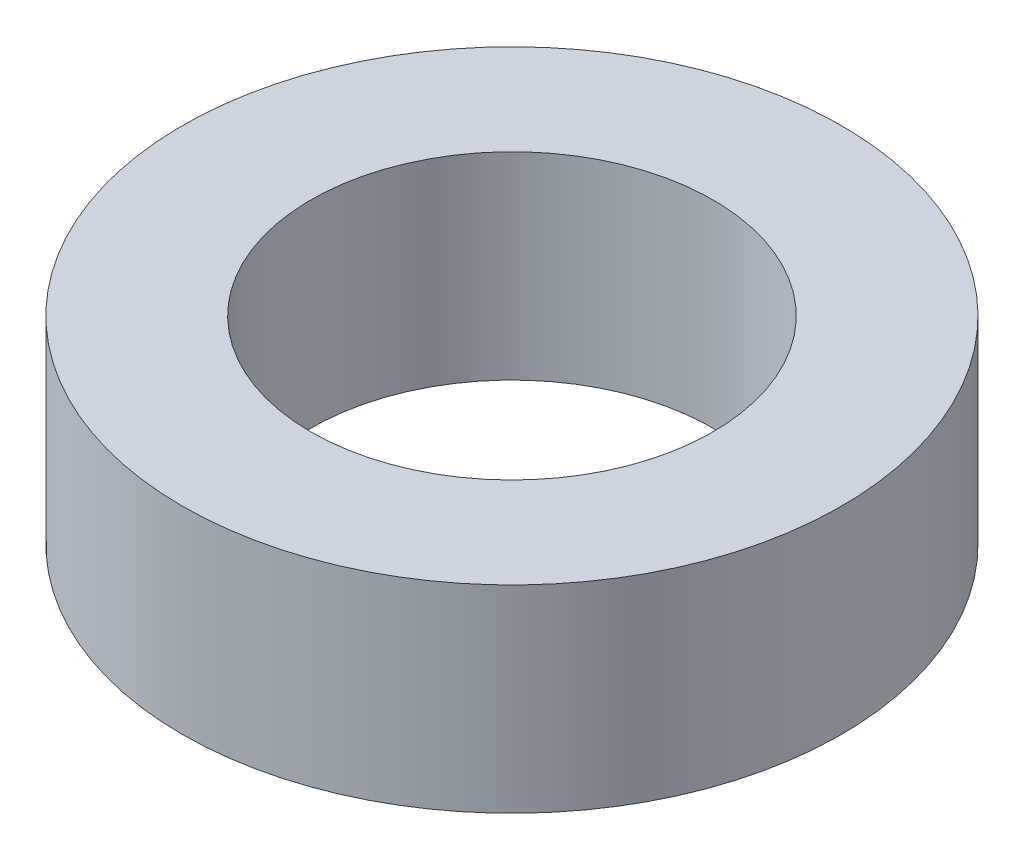
ISO-10303-21;
HEADER;
FILE_DESCRIPTION(('STEP AP214'),'2;1');
FILE_NAME('part.step','',(''),(''),'','','');
FILE_SCHEMA(('AUTOMOTIVE_DESIGN { 1 0 10303 214 1 1 1 1 }'));
ENDSEC;
DATA;
#1=APPLICATION_CONTEXT('core data for automotive mechanical design processes');
#2=APPLICATION_PROTOCOL_DEFINITION('international standard','automotive_design',2000,#1);
#3=PRODUCT_CONTEXT('',#1,'mechanical');
#4=PRODUCT('Part','Part','',(#3));
#5=PRODUCT_RELATED_PRODUCT_CATEGORY('part','',(#4));
#6=PRODUCT_DEFINITION_FORMATION('','',#4);
#7=PRODUCT_DEFINITION_CONTEXT('part definition',#1,'design');
#8=PRODUCT_DEFINITION('design','',#6,#7);
#9=PRODUCT_DEFINITION_SHAPE('','',#8);
#10=(LENGTH_UNIT() NAMED_UNIT(*) SI_UNIT(.MILLI.,.METRE.));
#11=(NAMED_UNIT(*) PLANE_ANGLE_UNIT() SI_UNIT($,.RADIAN.));
#12=(NAMED_UNIT(*) SI_UNIT($,.STERADIAN.) SOLID_ANGLE_UNIT());
#13=UNCERTAINTY_MEASURE_WITH_UNIT(LENGTH_MEASURE(1.E-05),#10,'distance_accuracy_value','');
#14=(GEOMETRIC_REPRESENTATION_CONTEXT(3) GLOBAL_UNCERTAINTY_ASSIGNED_CONTEXT((#13)) GLOBAL_UNIT_ASSIGNED_CONTEXT((#10,
#11,#12)) REPRESENTATION_CONTEXT('',''));
#15=CARTESIAN_POINT('',(0.,0.,0.));
#16=DIRECTION('',(0.,0.,1.));
#17=DIRECTION('',(1.,0.,0.));
#18=AXIS2_PLACEMENT_3D('',#15,#16,#17);
#19=CARTESIAN_POINT('',(0.,1.5,0.));
#20=DIRECTION('',(0.,1.,0.));
#21=DIRECTION('',(0.,0.,1.));
#22=AXIS2_PLACEMENT_3D('',#19,#20,#21);
#23=PLANE('',#22);
#24=CARTESIAN_POINT('',(0.,1.5,0.));
#25=DIRECTION('',(0.,1.,0.));
#26=DIRECTION('',(0.,0.,1.));
#27=AXIS2_PLACEMENT_3D('',#24,#25,#26);
#28=CIRCLE('',#27,5.);
#29=CARTESIAN_POINT('',(0.,1.5,5.));
#30=VERTEX_POINT('',#29);
#31=EDGE_CURVE('E10',#30,#30,#28,.T.);
#32=ORIENTED_EDGE('',*,*,#31,.T.);
#33=EDGE_LOOP('',(#32));
#34=FACE_BOUND('',#33,.T.);
#35=CARTESIAN_POINT('',(0.,1.5,0.));
#36=DIRECTION('',(0.,1.,0.));
#37=DIRECTION('',(0.,0.,1.));
#38=AXIS2_PLACEMENT_3D('',#35,#36,#37);
#39=CIRCLE('',#38,3.05);
#40=CARTESIAN_POINT('',(0.,1.5,3.05));
#41=VERTEX_POINT('',#40);
#42=EDGE_CURVE('E50',#41,#41,#39,.T.);
#43=ORIENTED_EDGE('',*,*,#42,.F.);
#44=EDGE_LOOP('',(#43));
#45=FACE_BOUND('',#44,.T.);
#46=ADVANCED_FACE('F37',(#34,#45),#23,.T.);
#47=CARTESIAN_POINT('',(0.,-1.5,0.));
#48=DIRECTION('',(0.,1.,0.));
#49=DIRECTION('',(0.,0.,1.));
#50=AXIS2_PLACEMENT_3D('',#47,#48,#49);
#51=PLANE('',#50);
#52=CARTESIAN_POINT('',(0.,-1.5,0.));
#53=DIRECTION('',(0.,1.,0.));
#54=DIRECTION('',(0.,0.,1.));
#55=AXIS2_PLACEMENT_3D('',#52,#53,#54);
#56=CIRCLE('',#55,5.);
#57=CARTESIAN_POINT('',(0.,-1.5,5.));
#58=VERTEX_POINT('',#57);
#59=EDGE_CURVE('E41',#58,#58,#56,.T.);
#60=ORIENTED_EDGE('',*,*,#59,.F.);
#61=EDGE_LOOP('',(#60));
#62=FACE_BOUND('',#61,.T.);
#63=CARTESIAN_POINT('',(0.,-1.5,0.));
#64=DIRECTION('',(0.,1.,0.));
#65=DIRECTION('',(0.,0.,1.));
#66=AXIS2_PLACEMENT_3D('',#63,#64,#65);
#67=CIRCLE('',#66,3.05);
#68=CARTESIAN_POINT('',(0.,-1.5,3.05));
#69=VERTEX_POINT('',#68);
#70=EDGE_CURVE('E52',#69,#69,#67,.T.);
#71=ORIENTED_EDGE('',*,*,#70,.T.);
#72=EDGE_LOOP('',(#71));
#73=FACE_BOUND('',#72,.T.);
#74=ADVANCED_FACE('F64',(#62,#73),#51,.F.);
#75=CARTESIAN_POINT('',(0.,1.5,0.));
#76=DIRECTION('',(0.,-1.,0.));
#77=DIRECTION('',(0.,0.,-1.));
#78=AXIS2_PLACEMENT_3D('',#75,#76,#77);
#79=CYLINDRICAL_SURFACE('',#78,5.);
#80=ORIENTED_EDGE('',*,*,#31,.F.);
#81=EDGE_LOOP('',(#80));
#82=FACE_BOUND('',#81,.T.);
#83=ORIENTED_EDGE('',*,*,#59,.T.);
#84=EDGE_LOOP('',(#83));
#85=FACE_BOUND('',#84,.T.);
#86=ADVANCED_FACE('F39',(#82,#85),#79,.T.);
#87=CARTESIAN_POINT('',(0.,1.5,0.));
#88=DIRECTION('',(0.,-1.,0.));
#89=DIRECTION('',(0.,0.,-1.));
#90=AXIS2_PLACEMENT_3D('',#87,#88,#89);
#91=CYLINDRICAL_SURFACE('',#90,3.05);
#92=ORIENTED_EDGE('',*,*,#42,.T.);
#93=EDGE_LOOP('',(#92));
#94=FACE_BOUND('',#93,.T.);
#95=ORIENTED_EDGE('',*,*,#70,.F.);
#96=EDGE_LOOP('',(#95));
#97=FACE_BOUND('',#96,.T.);
#98=ADVANCED_FACE('F60',(#94,#97),#91,.F.);
#99=CLOSED_SHELL('',(#46,#74,#86,#98));
#100=MANIFOLD_SOLID_BREP('B2',#99);
#101=ADVANCED_BREP_SHAPE_REPRESENTATION('',(#18,#100),#14);
#102=SHAPE_DEFINITION_REPRESENTATION(#9,#101);
ENDSEC;
END-ISO-10303-21;
